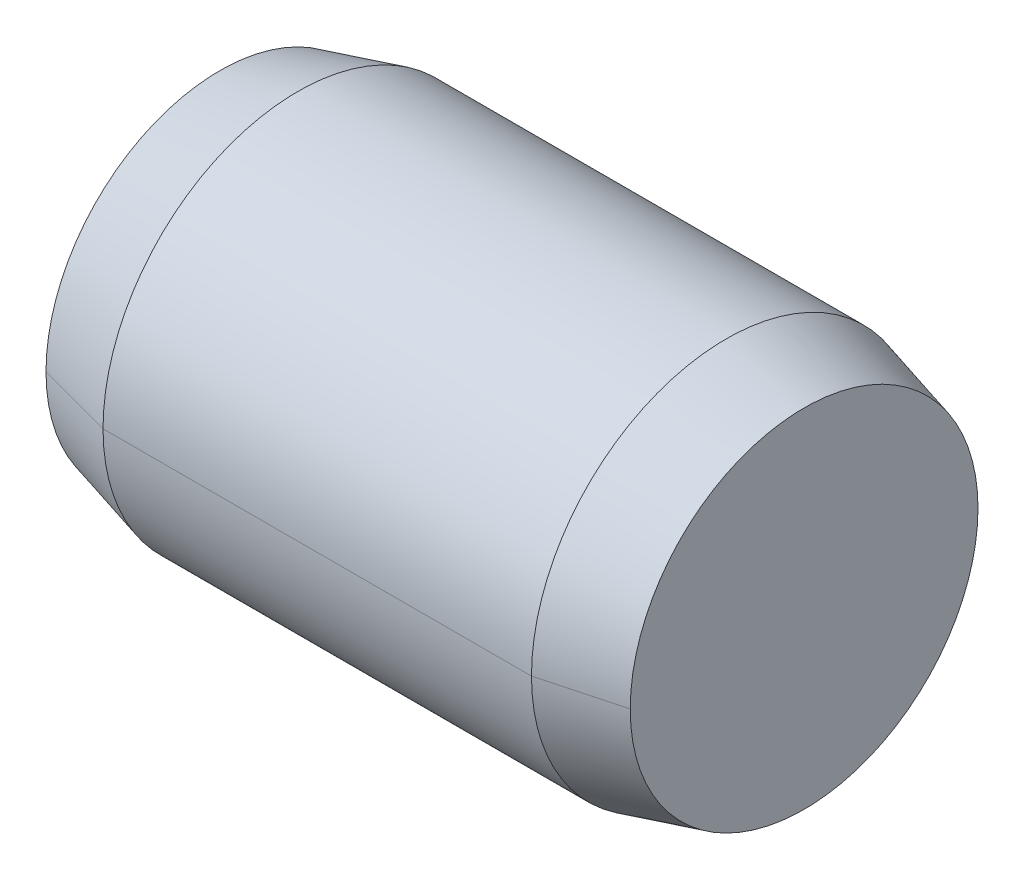
ISO-10303-21;
HEADER;
FILE_DESCRIPTION(('STEP AP214'),'2;1');
FILE_NAME('part.step','',(''),(''),'','','');
FILE_SCHEMA(('AUTOMOTIVE_DESIGN { 1 0 10303 214 1 1 1 1 }'));
ENDSEC;
DATA;
#1=APPLICATION_CONTEXT('core data for automotive mechanical design processes');
#2=APPLICATION_PROTOCOL_DEFINITION('international standard','automotive_design',2000,#1);
#3=PRODUCT_CONTEXT('',#1,'mechanical');
#4=PRODUCT('Part','Part','',(#3));
#5=PRODUCT_RELATED_PRODUCT_CATEGORY('part','',(#4));
#6=PRODUCT_DEFINITION_FORMATION('','',#4);
#7=PRODUCT_DEFINITION_CONTEXT('part definition',#1,'design');
#8=PRODUCT_DEFINITION('design','',#6,#7);
#9=PRODUCT_DEFINITION_SHAPE('','',#8);
#10=(LENGTH_UNIT() NAMED_UNIT(*) SI_UNIT(.MILLI.,.METRE.));
#11=(NAMED_UNIT(*) PLANE_ANGLE_UNIT() SI_UNIT($,.RADIAN.));
#12=(NAMED_UNIT(*) SI_UNIT($,.STERADIAN.) SOLID_ANGLE_UNIT());
#13=UNCERTAINTY_MEASURE_WITH_UNIT(LENGTH_MEASURE(1.E-05),#10,'distance_accuracy_value','');
#14=(GEOMETRIC_REPRESENTATION_CONTEXT(3) GLOBAL_UNCERTAINTY_ASSIGNED_CONTEXT((#13)) GLOBAL_UNIT_ASSIGNED_CONTEXT((#10,
#11,#12)) REPRESENTATION_CONTEXT('',''));
#15=CARTESIAN_POINT('',(0.,0.,0.));
#16=DIRECTION('',(0.,0.,1.));
#17=DIRECTION('',(1.,0.,0.));
#18=AXIS2_PLACEMENT_3D('',#15,#16,#17);
#19=CARTESIAN_POINT('',(2.,0.,0.));
#20=DIRECTION('',(1.,0.,0.));
#21=DIRECTION('',(0.,0.,-1.));
#22=AXIS2_PLACEMENT_3D('',#19,#20,#21);
#23=CONICAL_SURFACE('',#22,5.,0.261799387799143);
#24=CARTESIAN_POINT('',(0.,0.,0.));
#25=DIRECTION('',(-1.,0.,0.));
#26=DIRECTION('',(0.,0.,1.));
#27=AXIS2_PLACEMENT_3D('',#24,#25,#26);
#28=CIRCLE('',#27,4.46410161513777);
#29=CARTESIAN_POINT('',(0.,0.,4.46410161513777));
#30=VERTEX_POINT('',#29);
#31=CARTESIAN_POINT('',(0.,0.,-4.46410161513777));
#32=VERTEX_POINT('',#31);
#33=EDGE_CURVE('E73',#30,#32,#28,.T.);
#34=ORIENTED_EDGE('',*,*,#33,.F.);
#35=DIRECTION('',(0.96592582628907,0.,0.258819045102515));
#36=VECTOR('',#35,1.);
#37=CARTESIAN_POINT('',(2.,0.,5.));
#38=LINE('',#37,#36);
#39=CARTESIAN_POINT('',(2.,0.,5.));
#40=VERTEX_POINT('',#39);
#41=EDGE_CURVE('E76',#30,#40,#38,.T.);
#42=ORIENTED_EDGE('',*,*,#41,.T.);
#43=CARTESIAN_POINT('',(2.,0.,0.));
#44=DIRECTION('',(-1.,0.,0.));
#45=DIRECTION('',(0.,0.,1.));
#46=AXIS2_PLACEMENT_3D('',#43,#44,#45);
#47=CIRCLE('',#46,5.);
#48=CARTESIAN_POINT('',(2.,0.,-5.));
#49=VERTEX_POINT('',#48);
#50=EDGE_CURVE('E11',#40,#49,#47,.T.);
#51=ORIENTED_EDGE('',*,*,#50,.T.);
#52=DIRECTION('',(0.96592582628907,0.,-0.258819045102515));
#53=VECTOR('',#52,1.);
#54=CARTESIAN_POINT('',(2.,0.,-5.));
#55=LINE('',#54,#53);
#56=EDGE_CURVE('E78',#32,#49,#55,.T.);
#57=ORIENTED_EDGE('',*,*,#56,.F.);
#58=EDGE_LOOP('',(#34,#42,#51,#57));
#59=FACE_BOUND('',#58,.T.);
#60=ADVANCED_FACE('F17',(#59),#23,.T.);
#61=CARTESIAN_POINT('',(-6.35,0.,0.));
#62=DIRECTION('',(-1.,0.,0.));
#63=DIRECTION('',(0.,0.,1.));
#64=AXIS2_PLACEMENT_3D('',#61,#62,#63);
#65=CYLINDRICAL_SURFACE('',#64,5.);
#66=CARTESIAN_POINT('',(13.,0.,0.));
#67=DIRECTION('',(-1.,0.,0.));
#68=DIRECTION('',(0.,0.,1.));
#69=AXIS2_PLACEMENT_3D('',#66,#67,#68);
#70=CIRCLE('',#69,5.);
#71=CARTESIAN_POINT('',(13.,0.,5.));
#72=VERTEX_POINT('',#71);
#73=CARTESIAN_POINT('',(13.,0.,-5.));
#74=VERTEX_POINT('',#73);
#75=EDGE_CURVE('E21',#72,#74,#70,.T.);
#76=ORIENTED_EDGE('',*,*,#75,.T.);
#77=DIRECTION('',(-1.,0.,0.));
#78=VECTOR('',#77,1.);
#79=CARTESIAN_POINT('',(-6.35,0.,-5.));
#80=LINE('',#79,#78);
#81=EDGE_CURVE('E112',#74,#49,#80,.T.);
#82=ORIENTED_EDGE('',*,*,#81,.T.);
#83=ORIENTED_EDGE('',*,*,#50,.F.);
#84=DIRECTION('',(-1.,0.,0.));
#85=VECTOR('',#84,1.);
#86=CARTESIAN_POINT('',(-6.35,0.,5.));
#87=LINE('',#86,#85);
#88=EDGE_CURVE('E102',#72,#40,#87,.T.);
#89=ORIENTED_EDGE('',*,*,#88,.F.);
#90=EDGE_LOOP('',(#76,#82,#83,#89));
#91=FACE_BOUND('',#90,.T.);
#92=ADVANCED_FACE('F19',(#91),#65,.T.);
#93=CARTESIAN_POINT('',(15.,0.,0.));
#94=DIRECTION('',(-1.,0.,0.));
#95=DIRECTION('',(0.,0.,1.));
#96=AXIS2_PLACEMENT_3D('',#93,#94,#95);
#97=CONICAL_SURFACE('',#96,4.46410161513775,0.26179938779915);
#98=CARTESIAN_POINT('',(15.,0.,0.));
#99=DIRECTION('',(-1.,0.,0.));
#100=DIRECTION('',(0.,0.,1.));
#101=AXIS2_PLACEMENT_3D('',#98,#99,#100);
#102=CIRCLE('',#101,4.46410161513775);
#103=CARTESIAN_POINT('',(15.,0.,4.46410161513775));
#104=VERTEX_POINT('',#103);
#105=CARTESIAN_POINT('',(15.,0.,-4.46410161513775));
#106=VERTEX_POINT('',#105);
#107=EDGE_CURVE('E38',#104,#106,#102,.T.);
#108=ORIENTED_EDGE('',*,*,#107,.T.);
#109=DIRECTION('',(-0.965925826289068,0.,-0.258819045102522));
#110=VECTOR('',#109,1.);
#111=CARTESIAN_POINT('',(15.,0.,-4.46410161513775));
#112=LINE('',#111,#110);
#113=EDGE_CURVE('E99',#106,#74,#112,.T.);
#114=ORIENTED_EDGE('',*,*,#113,.T.);
#115=ORIENTED_EDGE('',*,*,#75,.F.);
#116=DIRECTION('',(-0.965925826289068,0.,0.258819045102522));
#117=VECTOR('',#116,1.);
#118=CARTESIAN_POINT('',(15.,0.,4.46410161513775));
#119=LINE('',#118,#117);
#120=EDGE_CURVE('E104',#104,#72,#119,.T.);
#121=ORIENTED_EDGE('',*,*,#120,.F.);
#122=EDGE_LOOP('',(#108,#114,#115,#121));
#123=FACE_BOUND('',#122,.T.);
#124=ADVANCED_FACE('F202',(#123),#97,.T.);
#125=CARTESIAN_POINT('',(0.,4.46410161513777,0.));
#126=DIRECTION('',(1.,0.,0.));
#127=DIRECTION('',(0.,1.,0.));
#128=AXIS2_PLACEMENT_3D('',#125,#126,#127);
#129=PLANE('',#128);
#130=CARTESIAN_POINT('',(0.,0.,0.));
#131=DIRECTION('',(-1.,0.,0.));
#132=DIRECTION('',(0.,0.,1.));
#133=AXIS2_PLACEMENT_3D('',#130,#131,#132);
#134=CIRCLE('',#133,4.46410161513777);
#135=EDGE_CURVE('E83',#32,#30,#134,.T.);
#136=ORIENTED_EDGE('',*,*,#135,.T.);
#137=ORIENTED_EDGE('',*,*,#33,.T.);
#138=EDGE_LOOP('',(#136,#137));
#139=FACE_BOUND('',#138,.T.);
#140=ADVANCED_FACE('F84',(#139),#129,.F.);
#141=CARTESIAN_POINT('',(15.,0.,0.));
#142=DIRECTION('',(-1.,0.,0.));
#143=DIRECTION('',(0.,0.,1.));
#144=AXIS2_PLACEMENT_3D('',#141,#142,#143);
#145=PLANE('',#144);
#146=ORIENTED_EDGE('',*,*,#107,.F.);
#147=CARTESIAN_POINT('',(15.,0.,0.));
#148=DIRECTION('',(-1.,0.,0.));
#149=DIRECTION('',(0.,0.,1.));
#150=AXIS2_PLACEMENT_3D('',#147,#148,#149);
#151=CIRCLE('',#150,4.46410161513775);
#152=EDGE_CURVE('E101',#106,#104,#151,.T.);
#153=ORIENTED_EDGE('',*,*,#152,.F.);
#154=EDGE_LOOP('',(#146,#153));
#155=FACE_BOUND('',#154,.T.);
#156=ADVANCED_FACE('F201',(#155),#145,.F.);
#157=CARTESIAN_POINT('',(15.,0.,0.));
#158=DIRECTION('',(-1.,0.,0.));
#159=DIRECTION('',(0.,0.,1.));
#160=AXIS2_PLACEMENT_3D('',#157,#158,#159);
#161=CONICAL_SURFACE('',#160,4.46410161513775,0.26179938779915);
#162=ORIENTED_EDGE('',*,*,#113,.F.);
#163=ORIENTED_EDGE('',*,*,#152,.T.);
#164=ORIENTED_EDGE('',*,*,#120,.T.);
#165=CARTESIAN_POINT('',(13.,0.,0.));
#166=DIRECTION('',(-1.,0.,0.));
#167=DIRECTION('',(0.,0.,1.));
#168=AXIS2_PLACEMENT_3D('',#165,#166,#167);
#169=CIRCLE('',#168,5.);
#170=EDGE_CURVE('E108',#74,#72,#169,.T.);
#171=ORIENTED_EDGE('',*,*,#170,.F.);
#172=EDGE_LOOP('',(#162,#163,#164,#171));
#173=FACE_BOUND('',#172,.T.);
#174=ADVANCED_FACE('F218',(#173),#161,.T.);
#175=CARTESIAN_POINT('',(-6.35,0.,0.));
#176=DIRECTION('',(-1.,0.,0.));
#177=DIRECTION('',(0.,0.,1.));
#178=AXIS2_PLACEMENT_3D('',#175,#176,#177);
#179=CYLINDRICAL_SURFACE('',#178,5.);
#180=ORIENTED_EDGE('',*,*,#81,.F.);
#181=ORIENTED_EDGE('',*,*,#170,.T.);
#182=ORIENTED_EDGE('',*,*,#88,.T.);
#183=CARTESIAN_POINT('',(2.,0.,0.));
#184=DIRECTION('',(-1.,0.,0.));
#185=DIRECTION('',(0.,0.,1.));
#186=AXIS2_PLACEMENT_3D('',#183,#184,#185);
#187=CIRCLE('',#186,5.);
#188=EDGE_CURVE('E91',#49,#40,#187,.T.);
#189=ORIENTED_EDGE('',*,*,#188,.F.);
#190=EDGE_LOOP('',(#180,#181,#182,#189));
#191=FACE_BOUND('',#190,.T.);
#192=ADVANCED_FACE('F210',(#191),#179,.T.);
#193=CARTESIAN_POINT('',(2.,0.,0.));
#194=DIRECTION('',(1.,0.,0.));
#195=DIRECTION('',(0.,0.,-1.));
#196=AXIS2_PLACEMENT_3D('',#193,#194,#195);
#197=CONICAL_SURFACE('',#196,5.,0.261799387799143);
#198=ORIENTED_EDGE('',*,*,#41,.F.);
#199=ORIENTED_EDGE('',*,*,#135,.F.);
#200=ORIENTED_EDGE('',*,*,#56,.T.);
#201=ORIENTED_EDGE('',*,*,#188,.T.);
#202=EDGE_LOOP('',(#198,#199,#200,#201));
#203=FACE_BOUND('',#202,.T.);
#204=ADVANCED_FACE('F89',(#203),#197,.T.);
#205=CLOSED_SHELL('',(#60,#92,#124,#140,#156,#174,#192,#204));
#206=MANIFOLD_SOLID_BREP('B1',#205);
#207=ADVANCED_BREP_SHAPE_REPRESENTATION('',(#18,#206),#14);
#208=SHAPE_DEFINITION_REPRESENTATION(#9,#207);
ENDSEC;
END-ISO-10303-21;
